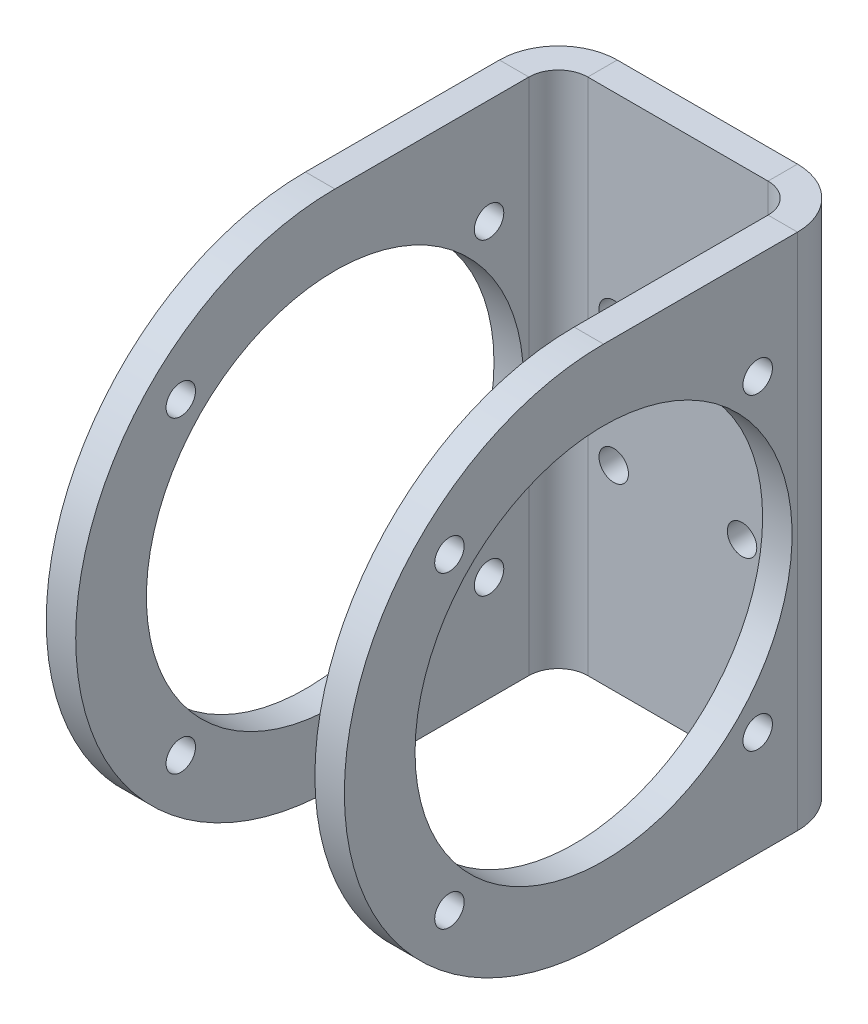
ISO-10303-21;
HEADER;
FILE_DESCRIPTION(('STEP AP214'),'2;1');
FILE_NAME('part.step','',(''),(''),'','','');
FILE_SCHEMA(('AUTOMOTIVE_DESIGN { 1 0 10303 214 1 1 1 1 }'));
ENDSEC;
DATA;
#1=APPLICATION_CONTEXT('core data for automotive mechanical design processes');
#2=APPLICATION_PROTOCOL_DEFINITION('international standard','automotive_design',2000,#1);
#3=PRODUCT_CONTEXT('',#1,'mechanical');
#4=PRODUCT('Part','Part','',(#3));
#5=PRODUCT_RELATED_PRODUCT_CATEGORY('part','',(#4));
#6=PRODUCT_DEFINITION_FORMATION('','',#4);
#7=PRODUCT_DEFINITION_CONTEXT('part definition',#1,'design');
#8=PRODUCT_DEFINITION('design','',#6,#7);
#9=PRODUCT_DEFINITION_SHAPE('','',#8);
#10=(LENGTH_UNIT() NAMED_UNIT(*) SI_UNIT(.MILLI.,.METRE.));
#11=(NAMED_UNIT(*) PLANE_ANGLE_UNIT() SI_UNIT($,.RADIAN.));
#12=(NAMED_UNIT(*) SI_UNIT($,.STERADIAN.) SOLID_ANGLE_UNIT());
#13=UNCERTAINTY_MEASURE_WITH_UNIT(LENGTH_MEASURE(1.E-05),#10,'distance_accuracy_value','');
#14=(GEOMETRIC_REPRESENTATION_CONTEXT(3) GLOBAL_UNCERTAINTY_ASSIGNED_CONTEXT((#13)) GLOBAL_UNIT_ASSIGNED_CONTEXT((#10,
#11,#12)) REPRESENTATION_CONTEXT('',''));
#15=CARTESIAN_POINT('',(0.,0.,0.));
#16=DIRECTION('',(0.,0.,1.));
#17=DIRECTION('',(1.,0.,0.));
#18=AXIS2_PLACEMENT_3D('',#15,#16,#17);
#19=CARTESIAN_POINT('',(-30.,22.,3.2));
#20=DIRECTION('',(0.,1.,0.));
#21=DIRECTION('',(-1.,0.,0.));
#22=AXIS2_PLACEMENT_3D('',#19,#20,#21);
#23=PLANE('',#22);
#24=DIRECTION('',(-1.,0.,0.));
#25=VECTOR('',#24,1.);
#26=CARTESIAN_POINT('',(-30.,22.,3.2));
#27=LINE('',#26,#25);
#28=CARTESIAN_POINT('',(7.65,22.,3.2));
#29=VERTEX_POINT('',#28);
#30=CARTESIAN_POINT('',(-7.65000000000002,22.,3.2));
#31=VERTEX_POINT('',#30);
#32=EDGE_CURVE('E320',#29,#31,#27,.T.);
#33=ORIENTED_EDGE('',*,*,#32,.F.);
#34=DIRECTION('',(0.,0.,-1.));
#35=VECTOR('',#34,1.);
#36=CARTESIAN_POINT('',(7.65000000000001,22.,3.2));
#37=LINE('',#36,#35);
#38=CARTESIAN_POINT('',(7.65000000000001,22.,0.7));
#39=VERTEX_POINT('',#38);
#40=EDGE_CURVE('E12',#29,#39,#37,.T.);
#41=ORIENTED_EDGE('',*,*,#40,.T.);
#42=DIRECTION('',(1.,0.,0.));
#43=VECTOR('',#42,1.);
#44=CARTESIAN_POINT('',(30.,22.,0.7));
#45=LINE('',#44,#43);
#46=CARTESIAN_POINT('',(-7.65000000000001,22.,0.7));
#47=VERTEX_POINT('',#46);
#48=EDGE_CURVE('E216',#39,#47,#45,.F.);
#49=ORIENTED_EDGE('',*,*,#48,.T.);
#50=DIRECTION('',(0.,0.,-1.));
#51=VECTOR('',#50,1.);
#52=CARTESIAN_POINT('',(-7.65000000000001,22.,3.2));
#53=LINE('',#52,#51);
#54=EDGE_CURVE('E245',#31,#47,#53,.T.);
#55=ORIENTED_EDGE('',*,*,#54,.F.);
#56=EDGE_LOOP('',(#33,#41,#49,#55));
#57=FACE_BOUND('',#56,.T.);
#58=ADVANCED_FACE('F49',(#57),#23,.T.);
#59=CARTESIAN_POINT('',(-30.,-22.,3.2));
#60=DIRECTION('',(0.,-1.,0.));
#61=DIRECTION('',(1.,0.,0.));
#62=AXIS2_PLACEMENT_3D('',#59,#60,#61);
#63=PLANE('',#62);
#64=DIRECTION('',(1.,0.,0.));
#65=VECTOR('',#64,1.);
#66=CARTESIAN_POINT('',(30.,-22.,0.7));
#67=LINE('',#66,#65);
#68=CARTESIAN_POINT('',(-7.65000000000001,-22.,0.7));
#69=VERTEX_POINT('',#68);
#70=CARTESIAN_POINT('',(7.65,-22.,0.7));
#71=VERTEX_POINT('',#70);
#72=EDGE_CURVE('E229',#69,#71,#67,.T.);
#73=ORIENTED_EDGE('',*,*,#72,.T.);
#74=DIRECTION('',(0.,0.,1.));
#75=VECTOR('',#74,1.);
#76=CARTESIAN_POINT('',(7.65000000000002,-22.,3.2));
#77=LINE('',#76,#75);
#78=CARTESIAN_POINT('',(7.65000000000001,-22.,3.2));
#79=VERTEX_POINT('',#78);
#80=EDGE_CURVE('E314',#71,#79,#77,.T.);
#81=ORIENTED_EDGE('',*,*,#80,.T.);
#82=DIRECTION('',(1.,0.,0.));
#83=VECTOR('',#82,1.);
#84=CARTESIAN_POINT('',(-30.,-22.,3.2));
#85=LINE('',#84,#83);
#86=CARTESIAN_POINT('',(-7.65000000000001,-22.,3.2));
#87=VERTEX_POINT('',#86);
#88=EDGE_CURVE('E52',#87,#79,#85,.T.);
#89=ORIENTED_EDGE('',*,*,#88,.F.);
#90=DIRECTION('',(0.,0.,1.));
#91=VECTOR('',#90,1.);
#92=CARTESIAN_POINT('',(-7.65,-22.,3.2));
#93=LINE('',#92,#91);
#94=EDGE_CURVE('E242',#69,#87,#93,.T.);
#95=ORIENTED_EDGE('',*,*,#94,.F.);
#96=EDGE_LOOP('',(#73,#81,#89,#95));
#97=FACE_BOUND('',#96,.T.);
#98=ADVANCED_FACE('F330',(#97),#63,.T.);
#99=CARTESIAN_POINT('',(30.,0.,3.2));
#100=DIRECTION('',(0.,0.,1.));
#101=DIRECTION('',(1.,0.,0.));
#102=AXIS2_PLACEMENT_3D('',#99,#100,#101);
#103=PLANE('',#102);
#104=CARTESIAN_POINT('',(-5.44472221513639,-5.44472221513645,3.2));
#105=DIRECTION('',(0.,0.,1.));
#106=DIRECTION('',(1.,0.,0.));
#107=AXIS2_PLACEMENT_3D('',#104,#105,#106);
#108=CIRCLE('',#107,1.25);
#109=CARTESIAN_POINT('',(-4.19472221513639,-5.44472221513645,3.2));
#110=VERTEX_POINT('',#109);
#111=EDGE_CURVE('E239',#110,#110,#108,.T.);
#112=ORIENTED_EDGE('',*,*,#111,.F.);
#113=EDGE_LOOP('',(#112));
#114=FACE_BOUND('',#113,.T.);
#115=CARTESIAN_POINT('',(5.44472221513639,5.44472221513645,3.2));
#116=DIRECTION('',(0.,0.,1.));
#117=DIRECTION('',(1.,0.,0.));
#118=AXIS2_PLACEMENT_3D('',#115,#116,#117);
#119=CIRCLE('',#118,1.25);
#120=CARTESIAN_POINT('',(6.69472221513638,5.44472221513645,3.2));
#121=VERTEX_POINT('',#120);
#122=EDGE_CURVE('E236',#121,#121,#119,.T.);
#123=ORIENTED_EDGE('',*,*,#122,.F.);
#124=EDGE_LOOP('',(#123));
#125=FACE_BOUND('',#124,.T.);
#126=CARTESIAN_POINT('',(-5.44472221513645,5.44472221513639,3.2));
#127=DIRECTION('',(0.,0.,1.));
#128=DIRECTION('',(1.,0.,0.));
#129=AXIS2_PLACEMENT_3D('',#126,#127,#128);
#130=CIRCLE('',#129,1.25);
#131=CARTESIAN_POINT('',(-4.19472221513645,5.44472221513639,3.2));
#132=VERTEX_POINT('',#131);
#133=EDGE_CURVE('E233',#132,#132,#130,.T.);
#134=ORIENTED_EDGE('',*,*,#133,.F.);
#135=EDGE_LOOP('',(#134));
#136=FACE_BOUND('',#135,.T.);
#137=CARTESIAN_POINT('',(5.44472221513645,-5.44472221513639,3.2));
#138=DIRECTION('',(0.,0.,1.));
#139=DIRECTION('',(1.,0.,0.));
#140=AXIS2_PLACEMENT_3D('',#137,#138,#139);
#141=CIRCLE('',#140,1.25);
#142=CARTESIAN_POINT('',(6.69472221513645,-5.44472221513639,3.2));
#143=VERTEX_POINT('',#142);
#144=EDGE_CURVE('E230',#143,#143,#141,.T.);
#145=ORIENTED_EDGE('',*,*,#144,.F.);
#146=EDGE_LOOP('',(#145));
#147=FACE_BOUND('',#146,.T.);
#148=ORIENTED_EDGE('',*,*,#88,.T.);
#149=DIRECTION('',(0.,1.,0.));
#150=VECTOR('',#149,1.);
#151=CARTESIAN_POINT('',(7.65000000000002,0.,3.2));
#152=LINE('',#151,#150);
#153=EDGE_CURVE('E305',#79,#29,#152,.T.);
#154=ORIENTED_EDGE('',*,*,#153,.T.);
#155=ORIENTED_EDGE('',*,*,#32,.T.);
#156=DIRECTION('',(0.,1.,0.));
#157=VECTOR('',#156,1.);
#158=CARTESIAN_POINT('',(-7.65000000000001,0.,3.2));
#159=LINE('',#158,#157);
#160=EDGE_CURVE('E208',#87,#31,#159,.T.);
#161=ORIENTED_EDGE('',*,*,#160,.F.);
#162=EDGE_LOOP('',(#148,#154,#155,#161));
#163=FACE_BOUND('',#162,.T.);
#164=ADVANCED_FACE('F326',(#114,#125,#136,#147,#163),#103,.T.);
#165=CARTESIAN_POINT('',(-10.15,-22.,22.1595137745191));
#166=DIRECTION('',(0.,-1.,0.));
#167=DIRECTION('',(0.,0.,-1.));
#168=AXIS2_PLACEMENT_3D('',#165,#166,#167);
#169=PLANE('',#168);
#170=DIRECTION('',(0.,0.,-1.));
#171=VECTOR('',#170,1.);
#172=CARTESIAN_POINT('',(-12.6500000000002,-22.,-37.8404862254809));
#173=LINE('',#172,#171);
#174=CARTESIAN_POINT('',(-12.65,-22.,22.1595137745191));
#175=VERTEX_POINT('',#174);
#176=CARTESIAN_POINT('',(-12.65,-22.,5.70000000000001));
#177=VERTEX_POINT('',#176);
#178=EDGE_CURVE('E284',#175,#177,#173,.T.);
#179=ORIENTED_EDGE('',*,*,#178,.T.);
#180=DIRECTION('',(1.,0.,0.));
#181=VECTOR('',#180,1.);
#182=CARTESIAN_POINT('',(-10.15,-22.,5.7));
#183=LINE('',#182,#181);
#184=CARTESIAN_POINT('',(-10.15,-22.,5.70000000000001));
#185=VERTEX_POINT('',#184);
#186=EDGE_CURVE('E297',#177,#185,#183,.T.);
#187=ORIENTED_EDGE('',*,*,#186,.T.);
#188=DIRECTION('',(0.,0.,-1.));
#189=VECTOR('',#188,1.);
#190=CARTESIAN_POINT('',(-10.15,-22.,22.1595137745191));
#191=LINE('',#190,#189);
#192=CARTESIAN_POINT('',(-10.15,-22.,22.1595137745191));
#193=VERTEX_POINT('',#192);
#194=EDGE_CURVE('E263',#193,#185,#191,.T.);
#195=ORIENTED_EDGE('',*,*,#194,.F.);
#196=DIRECTION('',(1.,0.,0.));
#197=VECTOR('',#196,1.);
#198=CARTESIAN_POINT('',(-10.15,-22.,22.1595137745191));
#199=LINE('',#198,#197);
#200=EDGE_CURVE('E270',#175,#193,#199,.T.);
#201=ORIENTED_EDGE('',*,*,#200,.F.);
#202=EDGE_LOOP('',(#179,#187,#195,#201));
#203=FACE_BOUND('',#202,.T.);
#204=ADVANCED_FACE('F388',(#203),#169,.T.);
#205=CARTESIAN_POINT('',(-10.15,22.,22.1595137745191));
#206=DIRECTION('',(0.,1.,0.));
#207=DIRECTION('',(0.,0.,1.));
#208=AXIS2_PLACEMENT_3D('',#205,#206,#207);
#209=PLANE('',#208);
#210=DIRECTION('',(0.,0.,1.));
#211=VECTOR('',#210,1.);
#212=CARTESIAN_POINT('',(-10.15,22.,22.1595137745191));
#213=LINE('',#212,#211);
#214=CARTESIAN_POINT('',(-10.15,22.,5.70000000000001));
#215=VERTEX_POINT('',#214);
#216=CARTESIAN_POINT('',(-10.15,22.,22.1595137745191));
#217=VERTEX_POINT('',#216);
#218=EDGE_CURVE('E259',#215,#217,#213,.T.);
#219=ORIENTED_EDGE('',*,*,#218,.F.);
#220=DIRECTION('',(-1.,0.,0.));
#221=VECTOR('',#220,1.);
#222=CARTESIAN_POINT('',(-10.15,22.,5.7));
#223=LINE('',#222,#221);
#224=CARTESIAN_POINT('',(-12.65,22.,5.70000000000001));
#225=VERTEX_POINT('',#224);
#226=EDGE_CURVE('E302',#215,#225,#223,.T.);
#227=ORIENTED_EDGE('',*,*,#226,.T.);
#228=DIRECTION('',(0.,0.,-1.));
#229=VECTOR('',#228,1.);
#230=CARTESIAN_POINT('',(-12.6500000000002,22.,-37.8404862254809));
#231=LINE('',#230,#229);
#232=CARTESIAN_POINT('',(-12.65,22.,22.1595137745191));
#233=VERTEX_POINT('',#232);
#234=EDGE_CURVE('E280',#225,#233,#231,.F.);
#235=ORIENTED_EDGE('',*,*,#234,.T.);
#236=DIRECTION('',(1.,0.,0.));
#237=VECTOR('',#236,1.);
#238=CARTESIAN_POINT('',(-10.15,22.,22.1595137745191));
#239=LINE('',#238,#237);
#240=EDGE_CURVE('E291',#233,#217,#239,.T.);
#241=ORIENTED_EDGE('',*,*,#240,.T.);
#242=EDGE_LOOP('',(#219,#227,#235,#241));
#243=FACE_BOUND('',#242,.T.);
#244=ADVANCED_FACE('F381',(#243),#209,.T.);
#245=CARTESIAN_POINT('',(-10.1500000000002,0.,-37.8404862254809));
#246=DIRECTION('',(1.,0.,0.));
#247=DIRECTION('',(0.,0.,-1.));
#248=AXIS2_PLACEMENT_3D('',#245,#246,#247);
#249=PLANE('',#248);
#250=CARTESIAN_POINT('',(-10.15,-13.0814754519512,9.07803832256801));
#251=DIRECTION('',(1.,0.,0.));
#252=DIRECTION('',(0.,0.,-1.));
#253=AXIS2_PLACEMENT_3D('',#250,#251,#252);
#254=CIRCLE('',#253,1.24999999999999);
#255=CARTESIAN_POINT('',(-10.15,-13.0814754519512,7.82803832256802));
#256=VERTEX_POINT('',#255);
#257=EDGE_CURVE('E267',#256,#256,#254,.T.);
#258=ORIENTED_EDGE('',*,*,#257,.F.);
#259=EDGE_LOOP('',(#258));
#260=FACE_BOUND('',#259,.T.);
#261=CARTESIAN_POINT('',(-10.1499999999999,13.0814754519512,35.2409892264702));
#262=DIRECTION('',(1.,0.,0.));
#263=DIRECTION('',(0.,0.,-1.));
#264=AXIS2_PLACEMENT_3D('',#261,#262,#263);
#265=CIRCLE('',#264,1.25);
#266=CARTESIAN_POINT('',(-10.1499999999999,13.0814754519512,33.9909892264702));
#267=VERTEX_POINT('',#266);
#268=EDGE_CURVE('E264',#267,#267,#265,.T.);
#269=ORIENTED_EDGE('',*,*,#268,.F.);
#270=EDGE_LOOP('',(#269));
#271=FACE_BOUND('',#270,.T.);
#272=CARTESIAN_POINT('',(-10.15,0.,22.1595137745191));
#273=DIRECTION('',(1.,0.,0.));
#274=DIRECTION('',(0.,0.,-1.));
#275=AXIS2_PLACEMENT_3D('',#272,#273,#274);
#276=CIRCLE('',#275,16.);
#277=CARTESIAN_POINT('',(-10.15,0.,6.1595137745191));
#278=VERTEX_POINT('',#277);
#279=EDGE_CURVE('E256',#278,#278,#276,.T.);
#280=ORIENTED_EDGE('',*,*,#279,.F.);
#281=EDGE_LOOP('',(#280));
#282=FACE_BOUND('',#281,.T.);
#283=CARTESIAN_POINT('',(-10.15,13.0814754519511,9.07803832256795));
#284=DIRECTION('',(1.,0.,0.));
#285=DIRECTION('',(0.,0.,-1.));
#286=AXIS2_PLACEMENT_3D('',#283,#284,#285);
#287=CIRCLE('',#286,1.24999999999999);
#288=CARTESIAN_POINT('',(-10.15,13.0814754519511,7.82803832256796));
#289=VERTEX_POINT('',#288);
#290=EDGE_CURVE('E252',#289,#289,#287,.T.);
#291=ORIENTED_EDGE('',*,*,#290,.F.);
#292=EDGE_LOOP('',(#291));
#293=FACE_BOUND('',#292,.T.);
#294=CARTESIAN_POINT('',(-10.1499999999999,-13.0814754519511,35.2409892264703));
#295=DIRECTION('',(1.,0.,0.));
#296=DIRECTION('',(0.,0.,-1.));
#297=AXIS2_PLACEMENT_3D('',#294,#295,#296);
#298=CIRCLE('',#297,1.24999999999999);
#299=CARTESIAN_POINT('',(-10.1499999999999,-13.0814754519511,33.9909892264703));
#300=VERTEX_POINT('',#299);
#301=EDGE_CURVE('E249',#300,#300,#298,.T.);
#302=ORIENTED_EDGE('',*,*,#301,.F.);
#303=EDGE_LOOP('',(#302));
#304=FACE_BOUND('',#303,.T.);
#305=ORIENTED_EDGE('',*,*,#194,.T.);
#306=DIRECTION('',(0.,1.,0.));
#307=VECTOR('',#306,1.);
#308=CARTESIAN_POINT('',(-10.15,0.,5.7));
#309=LINE('',#308,#307);
#310=EDGE_CURVE('E294',#185,#215,#309,.T.);
#311=ORIENTED_EDGE('',*,*,#310,.T.);
#312=ORIENTED_EDGE('',*,*,#218,.T.);
#313=CARTESIAN_POINT('',(-10.15,0.,22.1595137745191));
#314=DIRECTION('',(1.,0.,0.));
#315=DIRECTION('',(0.,0.,1.));
#316=AXIS2_PLACEMENT_3D('',#313,#314,#315);
#317=CIRCLE('',#316,22.);
#318=EDGE_CURVE('E260',#217,#193,#317,.T.);
#319=ORIENTED_EDGE('',*,*,#318,.T.);
#320=EDGE_LOOP('',(#305,#311,#312,#319));
#321=FACE_BOUND('',#320,.T.);
#322=ADVANCED_FACE('F379',(#260,#271,#282,#293,#304,#321),#249,.T.);
#323=CARTESIAN_POINT('',(-10.15,0.,22.1595137745191));
#324=DIRECTION('',(1.,0.,0.));
#325=DIRECTION('',(0.,0.,-1.));
#326=AXIS2_PLACEMENT_3D('',#323,#324,#325);
#327=CYLINDRICAL_SURFACE('',#326,22.);
#328=ORIENTED_EDGE('',*,*,#240,.F.);
#329=CARTESIAN_POINT('',(-12.65,0.,22.1595137745191));
#330=DIRECTION('',(1.,0.,0.));
#331=DIRECTION('',(0.,0.,-1.));
#332=AXIS2_PLACEMENT_3D('',#329,#330,#331);
#333=CIRCLE('',#332,22.);
#334=EDGE_CURVE('E281',#233,#175,#333,.T.);
#335=ORIENTED_EDGE('',*,*,#334,.T.);
#336=ORIENTED_EDGE('',*,*,#200,.T.);
#337=ORIENTED_EDGE('',*,*,#318,.F.);
#338=EDGE_LOOP('',(#328,#335,#336,#337));
#339=FACE_BOUND('',#338,.T.);
#340=ADVANCED_FACE('F386',(#339),#327,.T.);
#341=CARTESIAN_POINT('',(-10.1499999999999,-13.0814754519511,35.2409892264703));
#342=DIRECTION('',(1.,0.,0.));
#343=DIRECTION('',(0.,0.,-1.));
#344=AXIS2_PLACEMENT_3D('',#341,#342,#343);
#345=CYLINDRICAL_SURFACE('',#344,1.24999999999999);
#346=ORIENTED_EDGE('',*,*,#301,.T.);
#347=EDGE_LOOP('',(#346));
#348=FACE_BOUND('',#347,.T.);
#349=CARTESIAN_POINT('',(-12.6499999999999,-13.0814754519511,35.2409892264703));
#350=DIRECTION('',(1.,0.,0.));
#351=DIRECTION('',(0.,0.,-1.));
#352=AXIS2_PLACEMENT_3D('',#349,#350,#351);
#353=CIRCLE('',#352,1.24999999999999);
#354=CARTESIAN_POINT('',(-12.6499999999999,-13.0814754519511,33.9909892264703));
#355=VERTEX_POINT('',#354);
#356=EDGE_CURVE('E271',#355,#355,#353,.T.);
#357=ORIENTED_EDGE('',*,*,#356,.F.);
#358=EDGE_LOOP('',(#357));
#359=FACE_BOUND('',#358,.T.);
#360=ADVANCED_FACE('F457',(#348,#359),#345,.F.);
#361=CARTESIAN_POINT('',(-10.15,13.0814754519511,9.07803832256795));
#362=DIRECTION('',(1.,0.,0.));
#363=DIRECTION('',(0.,0.,-1.));
#364=AXIS2_PLACEMENT_3D('',#361,#362,#363);
#365=CYLINDRICAL_SURFACE('',#364,1.24999999999999);
#366=ORIENTED_EDGE('',*,*,#290,.T.);
#367=EDGE_LOOP('',(#366));
#368=FACE_BOUND('',#367,.T.);
#369=CARTESIAN_POINT('',(-12.65,13.0814754519511,9.07803832256795));
#370=DIRECTION('',(1.,0.,0.));
#371=DIRECTION('',(0.,0.,-1.));
#372=AXIS2_PLACEMENT_3D('',#369,#370,#371);
#373=CIRCLE('',#372,1.24999999999999);
#374=CARTESIAN_POINT('',(-12.65,13.0814754519511,7.82803832256796));
#375=VERTEX_POINT('',#374);
#376=EDGE_CURVE('E274',#375,#375,#373,.T.);
#377=ORIENTED_EDGE('',*,*,#376,.F.);
#378=EDGE_LOOP('',(#377));
#379=FACE_BOUND('',#378,.T.);
#380=ADVANCED_FACE('F460',(#368,#379),#365,.F.);
#381=CARTESIAN_POINT('',(-10.15,0.,22.1595137745191));
#382=DIRECTION('',(1.,0.,0.));
#383=DIRECTION('',(0.,0.,-1.));
#384=AXIS2_PLACEMENT_3D('',#381,#382,#383);
#385=CYLINDRICAL_SURFACE('',#384,16.);
#386=ORIENTED_EDGE('',*,*,#279,.T.);
#387=EDGE_LOOP('',(#386));
#388=FACE_BOUND('',#387,.T.);
#389=CARTESIAN_POINT('',(-12.65,0.,22.1595137745191));
#390=DIRECTION('',(1.,0.,0.));
#391=DIRECTION('',(0.,0.,-1.));
#392=AXIS2_PLACEMENT_3D('',#389,#390,#391);
#393=CIRCLE('',#392,16.);
#394=CARTESIAN_POINT('',(-12.65,0.,6.1595137745191));
#395=VERTEX_POINT('',#394);
#396=EDGE_CURVE('E277',#395,#395,#393,.T.);
#397=ORIENTED_EDGE('',*,*,#396,.F.);
#398=EDGE_LOOP('',(#397));
#399=FACE_BOUND('',#398,.T.);
#400=ADVANCED_FACE('F453',(#388,#399),#385,.F.);
#401=CARTESIAN_POINT('',(-10.1499999999999,13.0814754519512,35.2409892264702));
#402=DIRECTION('',(1.,0.,0.));
#403=DIRECTION('',(0.,0.,-1.));
#404=AXIS2_PLACEMENT_3D('',#401,#402,#403);
#405=CYLINDRICAL_SURFACE('',#404,1.25);
#406=ORIENTED_EDGE('',*,*,#268,.T.);
#407=EDGE_LOOP('',(#406));
#408=FACE_BOUND('',#407,.T.);
#409=CARTESIAN_POINT('',(-12.6499999999999,13.0814754519512,35.2409892264702));
#410=DIRECTION('',(1.,0.,0.));
#411=DIRECTION('',(0.,0.,-1.));
#412=AXIS2_PLACEMENT_3D('',#409,#410,#411);
#413=CIRCLE('',#412,1.25);
#414=CARTESIAN_POINT('',(-12.6499999999999,13.0814754519512,33.9909892264702));
#415=VERTEX_POINT('',#414);
#416=EDGE_CURVE('E285',#415,#415,#413,.T.);
#417=ORIENTED_EDGE('',*,*,#416,.F.);
#418=EDGE_LOOP('',(#417));
#419=FACE_BOUND('',#418,.T.);
#420=ADVANCED_FACE('F449',(#408,#419),#405,.F.);
#421=CARTESIAN_POINT('',(-10.15,-13.0814754519512,9.07803832256801));
#422=DIRECTION('',(1.,0.,0.));
#423=DIRECTION('',(0.,0.,-1.));
#424=AXIS2_PLACEMENT_3D('',#421,#422,#423);
#425=CYLINDRICAL_SURFACE('',#424,1.24999999999999);
#426=ORIENTED_EDGE('',*,*,#257,.T.);
#427=EDGE_LOOP('',(#426));
#428=FACE_BOUND('',#427,.T.);
#429=CARTESIAN_POINT('',(-12.65,-13.0814754519512,9.07803832256801));
#430=DIRECTION('',(1.,0.,0.));
#431=DIRECTION('',(0.,0.,-1.));
#432=AXIS2_PLACEMENT_3D('',#429,#430,#431);
#433=CIRCLE('',#432,1.24999999999999);
#434=CARTESIAN_POINT('',(-12.65,-13.0814754519512,7.82803832256802));
#435=VERTEX_POINT('',#434);
#436=EDGE_CURVE('E253',#435,#435,#433,.T.);
#437=ORIENTED_EDGE('',*,*,#436,.F.);
#438=EDGE_LOOP('',(#437));
#439=FACE_BOUND('',#438,.T.);
#440=ADVANCED_FACE('F440',(#428,#439),#425,.F.);
#441=CARTESIAN_POINT('',(-12.6500000000002,0.,-37.8404862254809));
#442=DIRECTION('',(1.,0.,0.));
#443=DIRECTION('',(0.,0.,-1.));
#444=AXIS2_PLACEMENT_3D('',#441,#442,#443);
#445=PLANE('',#444);
#446=DIRECTION('',(0.,1.,0.));
#447=VECTOR('',#446,1.);
#448=CARTESIAN_POINT('',(-12.65,0.,5.70000000000001));
#449=LINE('',#448,#447);
#450=EDGE_CURVE('E300',#177,#225,#449,.T.);
#451=ORIENTED_EDGE('',*,*,#450,.F.);
#452=ORIENTED_EDGE('',*,*,#178,.F.);
#453=ORIENTED_EDGE('',*,*,#334,.F.);
#454=ORIENTED_EDGE('',*,*,#234,.F.);
#455=EDGE_LOOP('',(#451,#452,#453,#454));
#456=FACE_BOUND('',#455,.T.);
#457=ORIENTED_EDGE('',*,*,#356,.T.);
#458=EDGE_LOOP('',(#457));
#459=FACE_BOUND('',#458,.T.);
#460=ORIENTED_EDGE('',*,*,#376,.T.);
#461=EDGE_LOOP('',(#460));
#462=FACE_BOUND('',#461,.T.);
#463=ORIENTED_EDGE('',*,*,#396,.T.);
#464=EDGE_LOOP('',(#463));
#465=FACE_BOUND('',#464,.T.);
#466=ORIENTED_EDGE('',*,*,#416,.T.);
#467=EDGE_LOOP('',(#466));
#468=FACE_BOUND('',#467,.T.);
#469=ORIENTED_EDGE('',*,*,#436,.T.);
#470=EDGE_LOOP('',(#469));
#471=FACE_BOUND('',#470,.T.);
#472=ADVANCED_FACE('F436',(#456,#459,#462,#465,#468,#471),#445,.F.);
#473=CARTESIAN_POINT('',(-5.44472221513639,-5.44472221513645,3.2));
#474=DIRECTION('',(0.,0.,1.));
#475=DIRECTION('',(1.,0.,0.));
#476=AXIS2_PLACEMENT_3D('',#473,#474,#475);
#477=CYLINDRICAL_SURFACE('',#476,1.25);
#478=ORIENTED_EDGE('',*,*,#111,.T.);
#479=EDGE_LOOP('',(#478));
#480=FACE_BOUND('',#479,.T.);
#481=CARTESIAN_POINT('',(-5.44472221513639,-5.44472221513645,0.7));
#482=DIRECTION('',(0.,0.,1.));
#483=DIRECTION('',(1.,0.,0.));
#484=AXIS2_PLACEMENT_3D('',#481,#482,#483);
#485=CIRCLE('',#484,1.25);
#486=CARTESIAN_POINT('',(-4.19472221513639,-5.44472221513645,0.7));
#487=VERTEX_POINT('',#486);
#488=EDGE_CURVE('E226',#487,#487,#485,.T.);
#489=ORIENTED_EDGE('',*,*,#488,.F.);
#490=EDGE_LOOP('',(#489));
#491=FACE_BOUND('',#490,.T.);
#492=ADVANCED_FACE('F439',(#480,#491),#477,.F.);
#493=CARTESIAN_POINT('',(5.44472221513639,5.44472221513645,3.2));
#494=DIRECTION('',(0.,0.,1.));
#495=DIRECTION('',(1.,0.,0.));
#496=AXIS2_PLACEMENT_3D('',#493,#494,#495);
#497=CYLINDRICAL_SURFACE('',#496,1.25);
#498=ORIENTED_EDGE('',*,*,#122,.T.);
#499=EDGE_LOOP('',(#498));
#500=FACE_BOUND('',#499,.T.);
#501=CARTESIAN_POINT('',(5.44472221513639,5.44472221513645,0.7));
#502=DIRECTION('',(0.,0.,1.));
#503=DIRECTION('',(1.,0.,0.));
#504=AXIS2_PLACEMENT_3D('',#501,#502,#503);
#505=CIRCLE('',#504,1.25);
#506=CARTESIAN_POINT('',(6.69472221513638,5.44472221513645,0.7));
#507=VERTEX_POINT('',#506);
#508=EDGE_CURVE('E223',#507,#507,#505,.T.);
#509=ORIENTED_EDGE('',*,*,#508,.F.);
#510=EDGE_LOOP('',(#509));
#511=FACE_BOUND('',#510,.T.);
#512=ADVANCED_FACE('F418',(#500,#511),#497,.F.);
#513=CARTESIAN_POINT('',(-5.44472221513645,5.44472221513639,3.2));
#514=DIRECTION('',(0.,0.,1.));
#515=DIRECTION('',(1.,0.,0.));
#516=AXIS2_PLACEMENT_3D('',#513,#514,#515);
#517=CYLINDRICAL_SURFACE('',#516,1.25);
#518=ORIENTED_EDGE('',*,*,#133,.T.);
#519=EDGE_LOOP('',(#518));
#520=FACE_BOUND('',#519,.T.);
#521=CARTESIAN_POINT('',(-5.44472221513645,5.44472221513639,0.7));
#522=DIRECTION('',(0.,0.,1.));
#523=DIRECTION('',(1.,0.,0.));
#524=AXIS2_PLACEMENT_3D('',#521,#522,#523);
#525=CIRCLE('',#524,1.25);
#526=CARTESIAN_POINT('',(-4.19472221513645,5.44472221513639,0.7));
#527=VERTEX_POINT('',#526);
#528=EDGE_CURVE('E220',#527,#527,#525,.T.);
#529=ORIENTED_EDGE('',*,*,#528,.F.);
#530=EDGE_LOOP('',(#529));
#531=FACE_BOUND('',#530,.T.);
#532=ADVANCED_FACE('F411',(#520,#531),#517,.F.);
#533=CARTESIAN_POINT('',(5.44472221513645,-5.44472221513639,3.2));
#534=DIRECTION('',(0.,0.,1.));
#535=DIRECTION('',(1.,0.,0.));
#536=AXIS2_PLACEMENT_3D('',#533,#534,#535);
#537=CYLINDRICAL_SURFACE('',#536,1.25);
#538=ORIENTED_EDGE('',*,*,#144,.T.);
#539=EDGE_LOOP('',(#538));
#540=FACE_BOUND('',#539,.T.);
#541=CARTESIAN_POINT('',(5.44472221513645,-5.44472221513639,0.7));
#542=DIRECTION('',(0.,0.,1.));
#543=DIRECTION('',(1.,0.,0.));
#544=AXIS2_PLACEMENT_3D('',#541,#542,#543);
#545=CIRCLE('',#544,1.25);
#546=CARTESIAN_POINT('',(6.69472221513645,-5.44472221513639,0.7));
#547=VERTEX_POINT('',#546);
#548=EDGE_CURVE('E217',#547,#547,#545,.T.);
#549=ORIENTED_EDGE('',*,*,#548,.F.);
#550=EDGE_LOOP('',(#549));
#551=FACE_BOUND('',#550,.T.);
#552=ADVANCED_FACE('F401',(#540,#551),#537,.F.);
#553=CARTESIAN_POINT('',(30.,0.,0.7));
#554=DIRECTION('',(0.,0.,1.));
#555=DIRECTION('',(1.,0.,0.));
#556=AXIS2_PLACEMENT_3D('',#553,#554,#555);
#557=PLANE('',#556);
#558=DIRECTION('',(0.,1.,0.));
#559=VECTOR('',#558,1.);
#560=CARTESIAN_POINT('',(7.65000000000002,0.,0.7));
#561=LINE('',#560,#559);
#562=EDGE_CURVE('E57',#71,#39,#561,.T.);
#563=ORIENTED_EDGE('',*,*,#562,.F.);
#564=ORIENTED_EDGE('',*,*,#72,.F.);
#565=DIRECTION('',(0.,1.,0.));
#566=VECTOR('',#565,1.);
#567=CARTESIAN_POINT('',(-7.65000000000001,0.,0.7));
#568=LINE('',#567,#566);
#569=EDGE_CURVE('E213',#69,#47,#568,.T.);
#570=ORIENTED_EDGE('',*,*,#569,.T.);
#571=ORIENTED_EDGE('',*,*,#48,.F.);
#572=EDGE_LOOP('',(#563,#564,#570,#571));
#573=FACE_BOUND('',#572,.T.);
#574=ORIENTED_EDGE('',*,*,#488,.T.);
#575=EDGE_LOOP('',(#574));
#576=FACE_BOUND('',#575,.T.);
#577=ORIENTED_EDGE('',*,*,#508,.T.);
#578=EDGE_LOOP('',(#577));
#579=FACE_BOUND('',#578,.T.);
#580=ORIENTED_EDGE('',*,*,#528,.T.);
#581=EDGE_LOOP('',(#580));
#582=FACE_BOUND('',#581,.T.);
#583=ORIENTED_EDGE('',*,*,#548,.T.);
#584=EDGE_LOOP('',(#583));
#585=FACE_BOUND('',#584,.T.);
#586=ADVANCED_FACE('F398',(#573,#576,#579,#582,#585),#557,.F.);
#587=CARTESIAN_POINT('',(-7.65000000000001,-22.,5.7));
#588=DIRECTION('',(0.,1.,0.));
#589=DIRECTION('',(0.,0.,1.));
#590=AXIS2_PLACEMENT_3D('',#587,#588,#589);
#591=PLANE('',#590);
#592=ORIENTED_EDGE('',*,*,#186,.F.);
#593=CARTESIAN_POINT('',(-7.65000000000001,-22.,5.7));
#594=DIRECTION('',(0.,-1.,0.));
#595=DIRECTION('',(1.,0.,0.));
#596=AXIS2_PLACEMENT_3D('',#593,#594,#595);
#597=CIRCLE('',#596,5.);
#598=EDGE_CURVE('E199',#177,#69,#597,.T.);
#599=ORIENTED_EDGE('',*,*,#598,.T.);
#600=ORIENTED_EDGE('',*,*,#94,.T.);
#601=CARTESIAN_POINT('',(-7.65000000000001,-22.,5.7));
#602=DIRECTION('',(0.,-1.,0.));
#603=DIRECTION('',(0.,0.,-1.));
#604=AXIS2_PLACEMENT_3D('',#601,#602,#603);
#605=CIRCLE('',#604,2.5);
#606=EDGE_CURVE('E203',#185,#87,#605,.T.);
#607=ORIENTED_EDGE('',*,*,#606,.F.);
#608=EDGE_LOOP('',(#592,#599,#600,#607));
#609=FACE_BOUND('',#608,.T.);
#610=ADVANCED_FACE('F393',(#609),#591,.F.);
#611=CARTESIAN_POINT('',(-7.65000000000002,22.,5.7));
#612=DIRECTION('',(0.,-1.,0.));
#613=DIRECTION('',(0.,0.,-1.));
#614=AXIS2_PLACEMENT_3D('',#611,#612,#613);
#615=PLANE('',#614);
#616=CARTESIAN_POINT('',(-7.65000000000002,22.,5.7));
#617=DIRECTION('',(0.,-1.,0.));
#618=DIRECTION('',(1.,0.,0.));
#619=AXIS2_PLACEMENT_3D('',#616,#617,#618);
#620=CIRCLE('',#619,5.);
#621=EDGE_CURVE('E206',#47,#225,#620,.F.);
#622=ORIENTED_EDGE('',*,*,#621,.T.);
#623=ORIENTED_EDGE('',*,*,#226,.F.);
#624=CARTESIAN_POINT('',(-7.65000000000002,22.,5.7));
#625=DIRECTION('',(0.,1.,0.));
#626=DIRECTION('',(0.,0.,1.));
#627=AXIS2_PLACEMENT_3D('',#624,#625,#626);
#628=CIRCLE('',#627,2.5);
#629=EDGE_CURVE('E72',#31,#215,#628,.T.);
#630=ORIENTED_EDGE('',*,*,#629,.F.);
#631=ORIENTED_EDGE('',*,*,#54,.T.);
#632=EDGE_LOOP('',(#622,#623,#630,#631));
#633=FACE_BOUND('',#632,.T.);
#634=ADVANCED_FACE('F374',(#633),#615,.F.);
#635=CARTESIAN_POINT('',(-7.65000000000002,44.4628814627728,5.7));
#636=DIRECTION('',(0.,-1.,0.));
#637=DIRECTION('',(1.,0.,0.));
#638=AXIS2_PLACEMENT_3D('',#635,#636,#637);
#639=CYLINDRICAL_SURFACE('',#638,2.5);
#640=ORIENTED_EDGE('',*,*,#160,.T.);
#641=ORIENTED_EDGE('',*,*,#629,.T.);
#642=ORIENTED_EDGE('',*,*,#310,.F.);
#643=ORIENTED_EDGE('',*,*,#606,.T.);
#644=EDGE_LOOP('',(#640,#641,#642,#643));
#645=FACE_BOUND('',#644,.T.);
#646=ADVANCED_FACE('F372',(#645),#639,.F.);
#647=CARTESIAN_POINT('',(-7.65000000000002,44.4628814627728,5.7));
#648=DIRECTION('',(0.,-1.,0.));
#649=DIRECTION('',(1.,0.,0.));
#650=AXIS2_PLACEMENT_3D('',#647,#648,#649);
#651=CYLINDRICAL_SURFACE('',#650,5.);
#652=ORIENTED_EDGE('',*,*,#569,.F.);
#653=ORIENTED_EDGE('',*,*,#598,.F.);
#654=ORIENTED_EDGE('',*,*,#450,.T.);
#655=ORIENTED_EDGE('',*,*,#621,.F.);
#656=EDGE_LOOP('',(#652,#653,#654,#655));
#657=FACE_BOUND('',#656,.T.);
#658=ADVANCED_FACE('F396',(#657),#651,.T.);
#659=CARTESIAN_POINT('',(7.65000000000002,-22.,5.7));
#660=DIRECTION('',(0.,1.,0.));
#661=DIRECTION('',(0.,0.,1.));
#662=AXIS2_PLACEMENT_3D('',#659,#660,#661);
#663=PLANE('',#662);
#664=ORIENTED_EDGE('',*,*,#80,.F.);
#665=CARTESIAN_POINT('',(7.65000000000002,-22.,5.7));
#666=DIRECTION('',(0.,1.,0.));
#667=DIRECTION('',(-1.,0.,0.));
#668=AXIS2_PLACEMENT_3D('',#665,#666,#667);
#669=CIRCLE('',#668,5.);
#670=CARTESIAN_POINT('',(12.65,-22.,5.70000000000003));
#671=VERTEX_POINT('',#670);
#672=EDGE_CURVE('E160',#71,#671,#669,.F.);
#673=ORIENTED_EDGE('',*,*,#672,.T.);
#674=DIRECTION('',(-1.,0.,0.));
#675=VECTOR('',#674,1.);
#676=CARTESIAN_POINT('',(10.15,-22.,5.70000000000002));
#677=LINE('',#676,#675);
#678=CARTESIAN_POINT('',(10.15,-22.,5.70000000000001));
#679=VERTEX_POINT('',#678);
#680=EDGE_CURVE('E184',#671,#679,#677,.T.);
#681=ORIENTED_EDGE('',*,*,#680,.T.);
#682=CARTESIAN_POINT('',(7.65000000000002,-22.,5.7));
#683=DIRECTION('',(0.,-1.,0.));
#684=DIRECTION('',(0.,0.,-1.));
#685=AXIS2_PLACEMENT_3D('',#682,#683,#684);
#686=CIRCLE('',#685,2.5);
#687=EDGE_CURVE('E192',#79,#679,#686,.T.);
#688=ORIENTED_EDGE('',*,*,#687,.F.);
#689=EDGE_LOOP('',(#664,#673,#681,#688));
#690=FACE_BOUND('',#689,.T.);
#691=ADVANCED_FACE('F332',(#690),#663,.F.);
#692=CARTESIAN_POINT('',(7.65000000000001,22.,5.7));
#693=DIRECTION('',(0.,-1.,0.));
#694=DIRECTION('',(0.,0.,-1.));
#695=AXIS2_PLACEMENT_3D('',#692,#693,#694);
#696=PLANE('',#695);
#697=DIRECTION('',(1.,0.,0.));
#698=VECTOR('',#697,1.);
#699=CARTESIAN_POINT('',(10.15,22.,5.70000000000002));
#700=LINE('',#699,#698);
#701=CARTESIAN_POINT('',(10.15,22.,5.70000000000001));
#702=VERTEX_POINT('',#701);
#703=CARTESIAN_POINT('',(12.65,22.,5.70000000000003));
#704=VERTEX_POINT('',#703);
#705=EDGE_CURVE('E187',#702,#704,#700,.T.);
#706=ORIENTED_EDGE('',*,*,#705,.T.);
#707=CARTESIAN_POINT('',(7.65000000000001,22.,5.7));
#708=DIRECTION('',(0.,1.,0.));
#709=DIRECTION('',(-1.,0.,0.));
#710=AXIS2_PLACEMENT_3D('',#707,#708,#709);
#711=CIRCLE('',#710,5.);
#712=EDGE_CURVE('E196',#704,#39,#711,.T.);
#713=ORIENTED_EDGE('',*,*,#712,.T.);
#714=ORIENTED_EDGE('',*,*,#40,.F.);
#715=CARTESIAN_POINT('',(7.65000000000001,22.,5.7));
#716=DIRECTION('',(0.,1.,0.));
#717=DIRECTION('',(0.,0.,1.));
#718=AXIS2_PLACEMENT_3D('',#715,#716,#717);
#719=CIRCLE('',#718,2.5);
#720=EDGE_CURVE('E195',#702,#29,#719,.T.);
#721=ORIENTED_EDGE('',*,*,#720,.F.);
#722=EDGE_LOOP('',(#706,#713,#714,#721));
#723=FACE_BOUND('',#722,.T.);
#724=ADVANCED_FACE('F367',(#723),#696,.F.);
#725=CARTESIAN_POINT('',(7.65000000000003,-44.4628814627728,5.7));
#726=DIRECTION('',(0.,1.,0.));
#727=DIRECTION('',(-1.,0.,0.));
#728=AXIS2_PLACEMENT_3D('',#725,#726,#727);
#729=CYLINDRICAL_SURFACE('',#728,2.5);
#730=ORIENTED_EDGE('',*,*,#720,.T.);
#731=ORIENTED_EDGE('',*,*,#153,.F.);
#732=ORIENTED_EDGE('',*,*,#687,.T.);
#733=DIRECTION('',(0.,1.,0.));
#734=VECTOR('',#733,1.);
#735=CARTESIAN_POINT('',(10.15,0.,5.70000000000002));
#736=LINE('',#735,#734);
#737=EDGE_CURVE('E189',#679,#702,#736,.T.);
#738=ORIENTED_EDGE('',*,*,#737,.T.);
#739=EDGE_LOOP('',(#730,#731,#732,#738));
#740=FACE_BOUND('',#739,.T.);
#741=ADVANCED_FACE('F364',(#740),#729,.F.);
#742=CARTESIAN_POINT('',(7.65000000000003,-44.4628814627728,5.7));
#743=DIRECTION('',(0.,1.,0.));
#744=DIRECTION('',(-1.,0.,0.));
#745=AXIS2_PLACEMENT_3D('',#742,#743,#744);
#746=CYLINDRICAL_SURFACE('',#745,5.);
#747=ORIENTED_EDGE('',*,*,#712,.F.);
#748=DIRECTION('',(0.,1.,0.));
#749=VECTOR('',#748,1.);
#750=CARTESIAN_POINT('',(12.65,0.,5.70000000000003));
#751=LINE('',#750,#749);
#752=EDGE_CURVE('E158',#671,#704,#751,.T.);
#753=ORIENTED_EDGE('',*,*,#752,.F.);
#754=ORIENTED_EDGE('',*,*,#672,.F.);
#755=ORIENTED_EDGE('',*,*,#562,.T.);
#756=EDGE_LOOP('',(#747,#753,#754,#755));
#757=FACE_BOUND('',#756,.T.);
#758=ADVANCED_FACE('F333',(#757),#746,.T.);
#759=CARTESIAN_POINT('',(10.1499999999999,-13.0814754519511,35.2409892264703));
#760=DIRECTION('',(-1.,0.,0.));
#761=DIRECTION('',(0.,0.,1.));
#762=AXIS2_PLACEMENT_3D('',#759,#760,#761);
#763=CYLINDRICAL_SURFACE('',#762,1.24999999999999);
#764=CARTESIAN_POINT('',(10.1499999999999,-13.0814754519511,35.2409892264703));
#765=DIRECTION('',(-1.,0.,0.));
#766=DIRECTION('',(0.,0.,-1.));
#767=AXIS2_PLACEMENT_3D('',#764,#765,#766);
#768=CIRCLE('',#767,1.24999999999999);
#769=CARTESIAN_POINT('',(10.1499999999999,-13.0814754519511,33.9909892264703));
#770=VERTEX_POINT('',#769);
#771=EDGE_CURVE('E181',#770,#770,#768,.T.);
#772=ORIENTED_EDGE('',*,*,#771,.T.);
#773=EDGE_LOOP('',(#772));
#774=FACE_BOUND('',#773,.T.);
#775=CARTESIAN_POINT('',(12.6499999999999,-13.0814754519511,35.2409892264703));
#776=DIRECTION('',(-1.,0.,0.));
#777=DIRECTION('',(0.,0.,1.));
#778=AXIS2_PLACEMENT_3D('',#775,#776,#777);
#779=CIRCLE('',#778,1.24999999999999);
#780=CARTESIAN_POINT('',(12.6499999999999,-13.0814754519511,36.4909892264703));
#781=VERTEX_POINT('',#780);
#782=EDGE_CURVE('E334',#781,#781,#779,.T.);
#783=ORIENTED_EDGE('',*,*,#782,.F.);
#784=EDGE_LOOP('',(#783));
#785=FACE_BOUND('',#784,.T.);
#786=ADVANCED_FACE('F626',(#774,#785),#763,.F.);
#787=CARTESIAN_POINT('',(10.15,13.0814754519511,9.07803832256798));
#788=DIRECTION('',(-1.,0.,0.));
#789=DIRECTION('',(0.,0.,1.));
#790=AXIS2_PLACEMENT_3D('',#787,#788,#789);
#791=CYLINDRICAL_SURFACE('',#790,1.24999999999999);
#792=CARTESIAN_POINT('',(10.15,13.0814754519511,9.07803832256798));
#793=DIRECTION('',(-1.,0.,0.));
#794=DIRECTION('',(0.,0.,-1.));
#795=AXIS2_PLACEMENT_3D('',#792,#793,#794);
#796=CIRCLE('',#795,1.24999999999999);
#797=CARTESIAN_POINT('',(10.15,13.0814754519511,7.82803832256799));
#798=VERTEX_POINT('',#797);
#799=EDGE_CURVE('E178',#798,#798,#796,.T.);
#800=ORIENTED_EDGE('',*,*,#799,.T.);
#801=EDGE_LOOP('',(#800));
#802=FACE_BOUND('',#801,.T.);
#803=CARTESIAN_POINT('',(12.65,13.0814754519511,9.07803832256798));
#804=DIRECTION('',(-1.,0.,0.));
#805=DIRECTION('',(0.,0.,1.));
#806=AXIS2_PLACEMENT_3D('',#803,#804,#805);
#807=CIRCLE('',#806,1.24999999999999);
#808=CARTESIAN_POINT('',(12.65,13.0814754519511,10.328038322568));
#809=VERTEX_POINT('',#808);
#810=EDGE_CURVE('E337',#809,#809,#807,.T.);
#811=ORIENTED_EDGE('',*,*,#810,.F.);
#812=EDGE_LOOP('',(#811));
#813=FACE_BOUND('',#812,.T.);
#814=ADVANCED_FACE('F632',(#802,#813),#791,.F.);
#815=CARTESIAN_POINT('',(10.1499999999999,0.,22.1595137745191));
#816=DIRECTION('',(-1.,0.,0.));
#817=DIRECTION('',(0.,0.,1.));
#818=AXIS2_PLACEMENT_3D('',#815,#816,#817);
#819=CYLINDRICAL_SURFACE('',#818,16.);
#820=CARTESIAN_POINT('',(10.1499999999999,0.,22.1595137745191));
#821=DIRECTION('',(-1.,0.,0.));
#822=DIRECTION('',(0.,0.,-1.));
#823=AXIS2_PLACEMENT_3D('',#820,#821,#822);
#824=CIRCLE('',#823,16.);
#825=CARTESIAN_POINT('',(10.15,0.,6.15951377451913));
#826=VERTEX_POINT('',#825);
#827=EDGE_CURVE('E175',#826,#826,#824,.T.);
#828=ORIENTED_EDGE('',*,*,#827,.T.);
#829=EDGE_LOOP('',(#828));
#830=FACE_BOUND('',#829,.T.);
#831=CARTESIAN_POINT('',(12.6499999999999,0.,22.1595137745191));
#832=DIRECTION('',(-1.,0.,0.));
#833=DIRECTION('',(0.,0.,1.));
#834=AXIS2_PLACEMENT_3D('',#831,#832,#833);
#835=CIRCLE('',#834,16.);
#836=CARTESIAN_POINT('',(12.6499999999999,0.,38.1595137745191));
#837=VERTEX_POINT('',#836);
#838=EDGE_CURVE('E342',#837,#837,#835,.T.);
#839=ORIENTED_EDGE('',*,*,#838,.F.);
#840=EDGE_LOOP('',(#839));
#841=FACE_BOUND('',#840,.T.);
#842=ADVANCED_FACE('F645',(#830,#841),#819,.F.);
#843=CARTESIAN_POINT('',(10.15,-13.0814754519512,9.07803832256803));
#844=DIRECTION('',(-1.,0.,0.));
#845=DIRECTION('',(0.,0.,1.));
#846=AXIS2_PLACEMENT_3D('',#843,#844,#845);
#847=CYLINDRICAL_SURFACE('',#846,1.24999999999999);
#848=CARTESIAN_POINT('',(10.15,-13.0814754519512,9.07803832256803));
#849=DIRECTION('',(-1.,0.,0.));
#850=DIRECTION('',(0.,0.,-1.));
#851=AXIS2_PLACEMENT_3D('',#848,#849,#850);
#852=CIRCLE('',#851,1.24999999999999);
#853=CARTESIAN_POINT('',(10.15,-13.0814754519512,7.82803832256804));
#854=VERTEX_POINT('',#853);
#855=EDGE_CURVE('E169',#854,#854,#852,.T.);
#856=ORIENTED_EDGE('',*,*,#855,.T.);
#857=EDGE_LOOP('',(#856));
#858=FACE_BOUND('',#857,.T.);
#859=CARTESIAN_POINT('',(12.65,-13.0814754519512,9.07803832256804));
#860=DIRECTION('',(-1.,0.,0.));
#861=DIRECTION('',(0.,0.,1.));
#862=AXIS2_PLACEMENT_3D('',#859,#860,#861);
#863=CIRCLE('',#862,1.24999999999999);
#864=CARTESIAN_POINT('',(12.65,-13.0814754519512,10.328038322568));
#865=VERTEX_POINT('',#864);
#866=EDGE_CURVE('E345',#865,#865,#863,.T.);
#867=ORIENTED_EDGE('',*,*,#866,.F.);
#868=EDGE_LOOP('',(#867));
#869=FACE_BOUND('',#868,.T.);
#870=ADVANCED_FACE('F657',(#858,#869),#847,.F.);
#871=CARTESIAN_POINT('',(10.1499999999999,13.0814754519511,35.2409892264702));
#872=DIRECTION('',(-1.,0.,0.));
#873=DIRECTION('',(0.,0.,1.));
#874=AXIS2_PLACEMENT_3D('',#871,#872,#873);
#875=CYLINDRICAL_SURFACE('',#874,1.25);
#876=CARTESIAN_POINT('',(10.1499999999999,13.0814754519511,35.2409892264702));
#877=DIRECTION('',(-1.,0.,0.));
#878=DIRECTION('',(0.,0.,-1.));
#879=AXIS2_PLACEMENT_3D('',#876,#877,#878);
#880=CIRCLE('',#879,1.25);
#881=CARTESIAN_POINT('',(10.1499999999999,13.0814754519511,33.9909892264702));
#882=VERTEX_POINT('',#881);
#883=EDGE_CURVE('E166',#882,#882,#880,.T.);
#884=ORIENTED_EDGE('',*,*,#883,.T.);
#885=EDGE_LOOP('',(#884));
#886=FACE_BOUND('',#885,.T.);
#887=CARTESIAN_POINT('',(12.6499999999999,13.0814754519511,35.2409892264703));
#888=DIRECTION('',(-1.,0.,0.));
#889=DIRECTION('',(0.,0.,1.));
#890=AXIS2_PLACEMENT_3D('',#887,#888,#889);
#891=CIRCLE('',#890,1.25);
#892=CARTESIAN_POINT('',(12.6499999999999,13.0814754519511,36.4909892264703));
#893=VERTEX_POINT('',#892);
#894=EDGE_CURVE('E348',#893,#893,#891,.T.);
#895=ORIENTED_EDGE('',*,*,#894,.F.);
#896=EDGE_LOOP('',(#895));
#897=FACE_BOUND('',#896,.T.);
#898=ADVANCED_FACE('F669',(#886,#897),#875,.F.);
#899=CARTESIAN_POINT('',(10.1499999999999,0.,22.1595137745191));
#900=DIRECTION('',(-1.,0.,0.));
#901=DIRECTION('',(0.,0.,1.));
#902=AXIS2_PLACEMENT_3D('',#899,#900,#901);
#903=CYLINDRICAL_SURFACE('',#902,22.);
#904=DIRECTION('',(-1.,0.,0.));
#905=VECTOR('',#904,1.);
#906=CARTESIAN_POINT('',(10.15,-22.,22.1595137745191));
#907=LINE('',#906,#905);
#908=CARTESIAN_POINT('',(12.65,-22.,22.1595137745191));
#909=VERTEX_POINT('',#908);
#910=CARTESIAN_POINT('',(10.15,-22.,22.1595137745191));
#911=VERTEX_POINT('',#910);
#912=EDGE_CURVE('E165',#909,#911,#907,.T.);
#913=ORIENTED_EDGE('',*,*,#912,.F.);
#914=CARTESIAN_POINT('',(12.6499999999999,0.,22.1595137745191));
#915=DIRECTION('',(-1.,0.,0.));
#916=DIRECTION('',(0.,0.,1.));
#917=AXIS2_PLACEMENT_3D('',#914,#915,#916);
#918=CIRCLE('',#917,22.);
#919=CARTESIAN_POINT('',(12.6499999999999,22.,22.1595137745191));
#920=VERTEX_POINT('',#919);
#921=EDGE_CURVE('E152',#909,#920,#918,.T.);
#922=ORIENTED_EDGE('',*,*,#921,.T.);
#923=DIRECTION('',(-1.,0.,0.));
#924=VECTOR('',#923,1.);
#925=CARTESIAN_POINT('',(10.1499999999999,22.,22.1595137745191));
#926=LINE('',#925,#924);
#927=CARTESIAN_POINT('',(10.1499999999999,22.,22.1595137745191));
#928=VERTEX_POINT('',#927);
#929=EDGE_CURVE('E140',#920,#928,#926,.T.);
#930=ORIENTED_EDGE('',*,*,#929,.T.);
#931=CARTESIAN_POINT('',(10.1499999999999,0.,22.1595137745191));
#932=DIRECTION('',(-1.,0.,0.));
#933=DIRECTION('',(0.,0.,1.));
#934=AXIS2_PLACEMENT_3D('',#931,#932,#933);
#935=CIRCLE('',#934,22.);
#936=EDGE_CURVE('E355',#911,#928,#935,.T.);
#937=ORIENTED_EDGE('',*,*,#936,.F.);
#938=EDGE_LOOP('',(#913,#922,#930,#937));
#939=FACE_BOUND('',#938,.T.);
#940=ADVANCED_FACE('F163',(#939),#903,.T.);
#941=CARTESIAN_POINT('',(10.1499999999999,0.,22.1595137745191));
#942=DIRECTION('',(-1.,0.,0.));
#943=DIRECTION('',(0.,0.,1.));
#944=AXIS2_PLACEMENT_3D('',#941,#942,#943);
#945=PLANE('',#944);
#946=ORIENTED_EDGE('',*,*,#737,.F.);
#947=DIRECTION('',(0.,0.,1.));
#948=VECTOR('',#947,1.);
#949=CARTESIAN_POINT('',(10.1500000000002,-22.,-37.8404862254809));
#950=LINE('',#949,#948);
#951=EDGE_CURVE('E151',#679,#911,#950,.T.);
#952=ORIENTED_EDGE('',*,*,#951,.T.);
#953=ORIENTED_EDGE('',*,*,#936,.T.);
#954=DIRECTION('',(0.,0.,-1.));
#955=VECTOR('',#954,1.);
#956=CARTESIAN_POINT('',(10.1500000000002,22.,-37.8404862254809));
#957=LINE('',#956,#955);
#958=EDGE_CURVE('E146',#928,#702,#957,.T.);
#959=ORIENTED_EDGE('',*,*,#958,.T.);
#960=EDGE_LOOP('',(#946,#952,#953,#959));
#961=FACE_BOUND('',#960,.T.);
#962=ORIENTED_EDGE('',*,*,#883,.F.);
#963=EDGE_LOOP('',(#962));
#964=FACE_BOUND('',#963,.T.);
#965=ORIENTED_EDGE('',*,*,#855,.F.);
#966=EDGE_LOOP('',(#965));
#967=FACE_BOUND('',#966,.T.);
#968=ORIENTED_EDGE('',*,*,#827,.F.);
#969=EDGE_LOOP('',(#968));
#970=FACE_BOUND('',#969,.T.);
#971=ORIENTED_EDGE('',*,*,#799,.F.);
#972=EDGE_LOOP('',(#971));
#973=FACE_BOUND('',#972,.T.);
#974=ORIENTED_EDGE('',*,*,#771,.F.);
#975=EDGE_LOOP('',(#974));
#976=FACE_BOUND('',#975,.T.);
#977=ADVANCED_FACE('F358',(#961,#964,#967,#970,#973,#976),#945,.T.);
#978=CARTESIAN_POINT('',(10.1500000000002,-22.,-37.8404862254809));
#979=DIRECTION('',(0.,-1.,0.));
#980=DIRECTION('',(0.,0.,1.));
#981=AXIS2_PLACEMENT_3D('',#978,#979,#980);
#982=PLANE('',#981);
#983=ORIENTED_EDGE('',*,*,#680,.F.);
#984=DIRECTION('',(0.,0.,1.));
#985=VECTOR('',#984,1.);
#986=CARTESIAN_POINT('',(12.65,-22.,22.1595137745191));
#987=LINE('',#986,#985);
#988=EDGE_CURVE('E352',#671,#909,#987,.T.);
#989=ORIENTED_EDGE('',*,*,#988,.T.);
#990=ORIENTED_EDGE('',*,*,#912,.T.);
#991=ORIENTED_EDGE('',*,*,#951,.F.);
#992=EDGE_LOOP('',(#983,#989,#990,#991));
#993=FACE_BOUND('',#992,.T.);
#994=ADVANCED_FACE('F362',(#993),#982,.T.);
#995=CARTESIAN_POINT('',(12.6499999999999,0.,22.1595137745191));
#996=DIRECTION('',(-1.,0.,0.));
#997=DIRECTION('',(0.,0.,1.));
#998=AXIS2_PLACEMENT_3D('',#995,#996,#997);
#999=PLANE('',#998);
#1000=ORIENTED_EDGE('',*,*,#894,.T.);
#1001=EDGE_LOOP('',(#1000));
#1002=FACE_BOUND('',#1001,.T.);
#1003=ORIENTED_EDGE('',*,*,#866,.T.);
#1004=EDGE_LOOP('',(#1003));
#1005=FACE_BOUND('',#1004,.T.);
#1006=ORIENTED_EDGE('',*,*,#838,.T.);
#1007=EDGE_LOOP('',(#1006));
#1008=FACE_BOUND('',#1007,.T.);
#1009=ORIENTED_EDGE('',*,*,#810,.T.);
#1010=EDGE_LOOP('',(#1009));
#1011=FACE_BOUND('',#1010,.T.);
#1012=ORIENTED_EDGE('',*,*,#782,.T.);
#1013=EDGE_LOOP('',(#1012));
#1014=FACE_BOUND('',#1013,.T.);
#1015=ORIENTED_EDGE('',*,*,#988,.F.);
#1016=ORIENTED_EDGE('',*,*,#752,.T.);
#1017=DIRECTION('',(0.,0.,1.));
#1018=VECTOR('',#1017,1.);
#1019=CARTESIAN_POINT('',(12.6499999999999,22.,22.1595137745191));
#1020=LINE('',#1019,#1018);
#1021=EDGE_CURVE('E143',#920,#704,#1020,.F.);
#1022=ORIENTED_EDGE('',*,*,#1021,.F.);
#1023=ORIENTED_EDGE('',*,*,#921,.F.);
#1024=EDGE_LOOP('',(#1015,#1016,#1022,#1023));
#1025=FACE_BOUND('',#1024,.T.);
#1026=ADVANCED_FACE('F156',(#1002,#1005,#1008,#1011,#1014,#1025),#999,.F.);
#1027=CARTESIAN_POINT('',(10.1500000000002,22.,-37.8404862254809));
#1028=DIRECTION('',(0.,1.,0.));
#1029=DIRECTION('',(0.,0.,-1.));
#1030=AXIS2_PLACEMENT_3D('',#1027,#1028,#1029);
#1031=PLANE('',#1030);
#1032=ORIENTED_EDGE('',*,*,#705,.F.);
#1033=ORIENTED_EDGE('',*,*,#958,.F.);
#1034=ORIENTED_EDGE('',*,*,#929,.F.);
#1035=ORIENTED_EDGE('',*,*,#1021,.T.);
#1036=EDGE_LOOP('',(#1032,#1033,#1034,#1035));
#1037=FACE_BOUND('',#1036,.T.);
#1038=ADVANCED_FACE('F142',(#1037),#1031,.T.);
#1039=CLOSED_SHELL('',(#58,#98,#164,#204,#244,#322,#340,#360,#380,#400,#420,#440,#472,#492,#512,
#532,#552,#586,#610,#634,#646,#658,#691,#724,#741,#758,#786,#814,#842,#870,#898,#940,#977,#994,
#1026,#1038));
#1040=MANIFOLD_SOLID_BREP('B2',#1039);
#1041=ADVANCED_BREP_SHAPE_REPRESENTATION('',(#18,#1040),#14);
#1042=SHAPE_DEFINITION_REPRESENTATION(#9,#1041);
ENDSEC;
END-ISO-10303-21;
